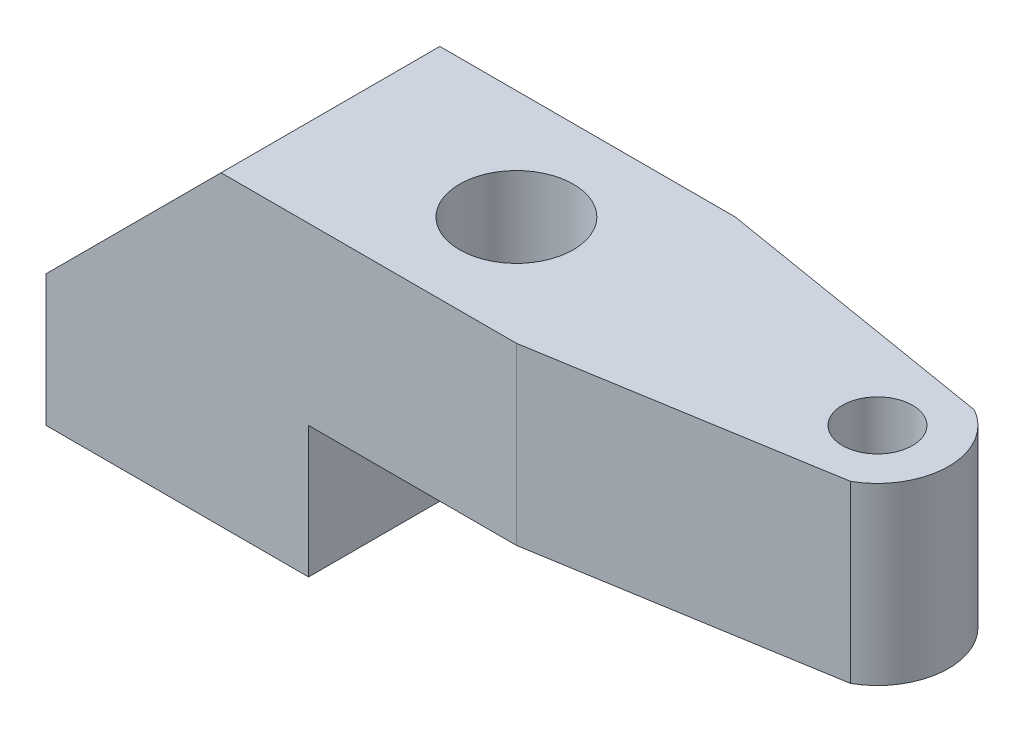
ISO-10303-21;
HEADER;
FILE_DESCRIPTION(('STEP AP214'),'2;1');
FILE_NAME('part.step','',(''),(''),'','','');
FILE_SCHEMA(('AUTOMOTIVE_DESIGN { 1 0 10303 214 1 1 1 1 }'));
ENDSEC;
DATA;
#1=APPLICATION_CONTEXT('core data for automotive mechanical design processes');
#2=APPLICATION_PROTOCOL_DEFINITION('international standard','automotive_design',2000,#1);
#3=PRODUCT_CONTEXT('',#1,'mechanical');
#4=PRODUCT('Part','Part','',(#3));
#5=PRODUCT_RELATED_PRODUCT_CATEGORY('part','',(#4));
#6=PRODUCT_DEFINITION_FORMATION('','',#4);
#7=PRODUCT_DEFINITION_CONTEXT('part definition',#1,'design');
#8=PRODUCT_DEFINITION('design','',#6,#7);
#9=PRODUCT_DEFINITION_SHAPE('','',#8);
#10=(LENGTH_UNIT() NAMED_UNIT(*) SI_UNIT(.MILLI.,.METRE.));
#11=(NAMED_UNIT(*) PLANE_ANGLE_UNIT() SI_UNIT($,.RADIAN.));
#12=(NAMED_UNIT(*) SI_UNIT($,.STERADIAN.) SOLID_ANGLE_UNIT());
#13=UNCERTAINTY_MEASURE_WITH_UNIT(LENGTH_MEASURE(1.E-05),#10,'distance_accuracy_value','');
#14=(GEOMETRIC_REPRESENTATION_CONTEXT(3) GLOBAL_UNCERTAINTY_ASSIGNED_CONTEXT((#13)) GLOBAL_UNIT_ASSIGNED_CONTEXT((#10,
#11,#12)) REPRESENTATION_CONTEXT('',''));
#15=CARTESIAN_POINT('',(0.,0.,0.));
#16=DIRECTION('',(0.,0.,1.));
#17=DIRECTION('',(1.,0.,0.));
#18=AXIS2_PLACEMENT_3D('',#15,#16,#17);
#19=CARTESIAN_POINT('',(231.,14.,-37.25));
#20=DIRECTION('',(0.,-1.,0.));
#21=DIRECTION('',(0.,0.,-1.));
#22=AXIS2_PLACEMENT_3D('',#19,#20,#21);
#23=PLANE('',#22);
#24=DIRECTION('',(-1.,0.,0.));
#25=VECTOR('',#24,1.);
#26=CARTESIAN_POINT('',(219.5,14.,-42.25));
#27=LINE('',#26,#25);
#28=CARTESIAN_POINT('',(219.5,14.,-42.25));
#29=VERTEX_POINT('',#28);
#30=CARTESIAN_POINT('',(206.,14.,-42.25));
#31=VERTEX_POINT('',#30);
#32=EDGE_CURVE('E157',#29,#31,#27,.T.);
#33=ORIENTED_EDGE('',*,*,#32,.T.);
#34=DIRECTION('',(0.,0.,1.));
#35=VECTOR('',#34,1.);
#36=CARTESIAN_POINT('',(206.,14.,-37.25));
#37=LINE('',#36,#35);
#38=CARTESIAN_POINT('',(206.,14.,-32.25));
#39=VERTEX_POINT('',#38);
#40=EDGE_CURVE('E189',#31,#39,#37,.T.);
#41=ORIENTED_EDGE('',*,*,#40,.T.);
#42=DIRECTION('',(1.,0.,0.));
#43=VECTOR('',#42,1.);
#44=CARTESIAN_POINT('',(219.5,14.,-32.25));
#45=LINE('',#44,#43);
#46=CARTESIAN_POINT('',(219.5,14.,-32.25));
#47=VERTEX_POINT('',#46);
#48=EDGE_CURVE('E160',#39,#47,#45,.T.);
#49=ORIENTED_EDGE('',*,*,#48,.T.);
#50=DIRECTION('',(0.986542536377933,0.,-0.163504813130974));
#51=VECTOR('',#50,1.);
#52=CARTESIAN_POINT('',(232.6,14.,-34.4211309680369));
#53=LINE('',#52,#51);
#54=CARTESIAN_POINT('',(232.6,14.,-34.4211309680369));
#55=VERTEX_POINT('',#54);
#56=EDGE_CURVE('E163',#47,#55,#53,.T.);
#57=ORIENTED_EDGE('',*,*,#56,.T.);
#58=CARTESIAN_POINT('',(231.,14.,-37.25));
#59=DIRECTION('',(0.,1.,0.));
#60=DIRECTION('',(0.,0.,-1.));
#61=AXIS2_PLACEMENT_3D('',#58,#59,#60);
#62=CIRCLE('',#61,3.24999999999998);
#63=CARTESIAN_POINT('',(232.6,14.,-40.0788690319631));
#64=VERTEX_POINT('',#63);
#65=EDGE_CURVE('E165',#55,#64,#62,.T.);
#66=ORIENTED_EDGE('',*,*,#65,.T.);
#67=DIRECTION('',(-0.986542536377933,0.,-0.163504813130976));
#68=VECTOR('',#67,1.);
#69=CARTESIAN_POINT('',(232.6,14.,-40.0788690319631));
#70=LINE('',#69,#68);
#71=EDGE_CURVE('E167',#64,#29,#70,.T.);
#72=ORIENTED_EDGE('',*,*,#71,.T.);
#73=EDGE_LOOP('',(#33,#41,#49,#57,#66,#72));
#74=FACE_BOUND('',#73,.T.);
#75=CARTESIAN_POINT('',(231.,14.,-37.25));
#76=DIRECTION('',(0.,1.,0.));
#77=DIRECTION('',(0.,0.,1.));
#78=AXIS2_PLACEMENT_3D('',#75,#76,#77);
#79=CIRCLE('',#78,1.59999999999999);
#80=CARTESIAN_POINT('',(231.,14.,-35.65));
#81=VERTEX_POINT('',#80);
#82=EDGE_CURVE('E152',#81,#81,#79,.T.);
#83=ORIENTED_EDGE('',*,*,#82,.F.);
#84=EDGE_LOOP('',(#83));
#85=FACE_BOUND('',#84,.T.);
#86=CARTESIAN_POINT('',(214.5,14.,-37.25));
#87=DIRECTION('',(0.,1.,0.));
#88=DIRECTION('',(0.,0.,1.));
#89=AXIS2_PLACEMENT_3D('',#86,#87,#88);
#90=CIRCLE('',#89,2.59999999999999);
#91=CARTESIAN_POINT('',(214.5,14.,-34.65));
#92=VERTEX_POINT('',#91);
#93=EDGE_CURVE('E145',#92,#92,#90,.T.);
#94=ORIENTED_EDGE('',*,*,#93,.F.);
#95=EDGE_LOOP('',(#94));
#96=FACE_BOUND('',#95,.T.);
#97=ADVANCED_FACE('F42',(#74,#85,#96),#23,.F.);
#98=CARTESIAN_POINT('',(231.,6.,-37.25));
#99=DIRECTION('',(0.,-1.,0.));
#100=DIRECTION('',(0.,0.,-1.));
#101=AXIS2_PLACEMENT_3D('',#98,#99,#100);
#102=PLANE('',#101);
#103=DIRECTION('',(0.,0.,1.));
#104=VECTOR('',#103,1.);
#105=CARTESIAN_POINT('',(210.,6.,-42.25));
#106=LINE('',#105,#104);
#107=CARTESIAN_POINT('',(210.,6.,-42.25));
#108=VERTEX_POINT('',#107);
#109=CARTESIAN_POINT('',(210.,6.,-32.25));
#110=VERTEX_POINT('',#109);
#111=EDGE_CURVE('E116',#108,#110,#106,.T.);
#112=ORIENTED_EDGE('',*,*,#111,.F.);
#113=DIRECTION('',(-1.,0.,0.));
#114=VECTOR('',#113,1.);
#115=CARTESIAN_POINT('',(219.5,6.,-42.25));
#116=LINE('',#115,#114);
#117=CARTESIAN_POINT('',(219.5,6.,-42.25));
#118=VERTEX_POINT('',#117);
#119=EDGE_CURVE('E122',#118,#108,#116,.T.);
#120=ORIENTED_EDGE('',*,*,#119,.F.);
#121=DIRECTION('',(-0.986542536377933,0.,-0.163504813130976));
#122=VECTOR('',#121,1.);
#123=CARTESIAN_POINT('',(232.6,6.,-40.0788690319631));
#124=LINE('',#123,#122);
#125=CARTESIAN_POINT('',(232.6,6.,-40.0788690319631));
#126=VERTEX_POINT('',#125);
#127=EDGE_CURVE('E161',#126,#118,#124,.T.);
#128=ORIENTED_EDGE('',*,*,#127,.F.);
#129=CARTESIAN_POINT('',(231.,6.,-37.25));
#130=DIRECTION('',(0.,1.,0.));
#131=DIRECTION('',(0.,0.,-1.));
#132=AXIS2_PLACEMENT_3D('',#129,#130,#131);
#133=CIRCLE('',#132,3.24999999999998);
#134=CARTESIAN_POINT('',(232.6,6.,-34.4211309680369));
#135=VERTEX_POINT('',#134);
#136=EDGE_CURVE('E172',#135,#126,#133,.T.);
#137=ORIENTED_EDGE('',*,*,#136,.F.);
#138=DIRECTION('',(0.986542536377933,0.,-0.163504813130974));
#139=VECTOR('',#138,1.);
#140=CARTESIAN_POINT('',(232.6,6.,-34.4211309680369));
#141=LINE('',#140,#139);
#142=CARTESIAN_POINT('',(219.5,6.,-32.25));
#143=VERTEX_POINT('',#142);
#144=EDGE_CURVE('E119',#143,#135,#141,.T.);
#145=ORIENTED_EDGE('',*,*,#144,.F.);
#146=DIRECTION('',(1.,0.,0.));
#147=VECTOR('',#146,1.);
#148=CARTESIAN_POINT('',(219.5,6.,-32.25));
#149=LINE('',#148,#147);
#150=EDGE_CURVE('E110',#110,#143,#149,.T.);
#151=ORIENTED_EDGE('',*,*,#150,.F.);
#152=EDGE_LOOP('',(#112,#120,#128,#137,#145,#151));
#153=FACE_BOUND('',#152,.T.);
#154=CARTESIAN_POINT('',(231.,6.,-37.25));
#155=DIRECTION('',(0.,1.,0.));
#156=DIRECTION('',(0.,0.,1.));
#157=AXIS2_PLACEMENT_3D('',#154,#155,#156);
#158=CIRCLE('',#157,1.59999999999999);
#159=CARTESIAN_POINT('',(231.,6.,-35.65));
#160=VERTEX_POINT('',#159);
#161=EDGE_CURVE('E148',#160,#160,#158,.T.);
#162=ORIENTED_EDGE('',*,*,#161,.T.);
#163=EDGE_LOOP('',(#162));
#164=FACE_BOUND('',#163,.T.);
#165=CARTESIAN_POINT('',(214.5,6.,-37.25));
#166=DIRECTION('',(0.,1.,0.));
#167=DIRECTION('',(0.,0.,1.));
#168=AXIS2_PLACEMENT_3D('',#165,#166,#167);
#169=CIRCLE('',#168,2.59999999999999);
#170=CARTESIAN_POINT('',(214.5,6.,-34.65));
#171=VERTEX_POINT('',#170);
#172=EDGE_CURVE('E149',#171,#171,#169,.T.);
#173=ORIENTED_EDGE('',*,*,#172,.T.);
#174=EDGE_LOOP('',(#173));
#175=FACE_BOUND('',#174,.T.);
#176=ADVANCED_FACE('F112',(#153,#164,#175),#102,.T.);
#177=CARTESIAN_POINT('',(219.5,14.,-42.25));
#178=DIRECTION('',(0.,0.,1.));
#179=DIRECTION('',(1.,0.,0.));
#180=AXIS2_PLACEMENT_3D('',#177,#178,#179);
#181=PLANE('',#180);
#182=DIRECTION('',(0.,-1.,0.));
#183=VECTOR('',#182,1.);
#184=CARTESIAN_POINT('',(198.,14.,-42.25));
#185=LINE('',#184,#183);
#186=CARTESIAN_POINT('',(198.,5.99999999999996,-42.25));
#187=VERTEX_POINT('',#186);
#188=CARTESIAN_POINT('',(198.,0.,-42.25));
#189=VERTEX_POINT('',#188);
#190=EDGE_CURVE('E187',#187,#189,#185,.T.);
#191=ORIENTED_EDGE('',*,*,#190,.F.);
#192=DIRECTION('',(-0.707106781186546,-0.707106781186549,0.));
#193=VECTOR('',#192,1.);
#194=CARTESIAN_POINT('',(206.,14.,-42.25));
#195=LINE('',#194,#193);
#196=EDGE_CURVE('E12',#187,#31,#195,.F.);
#197=ORIENTED_EDGE('',*,*,#196,.T.);
#198=ORIENTED_EDGE('',*,*,#32,.F.);
#199=DIRECTION('',(0.,-1.,0.));
#200=VECTOR('',#199,1.);
#201=CARTESIAN_POINT('',(219.5,14.,-42.25));
#202=LINE('',#201,#200);
#203=EDGE_CURVE('E169',#29,#118,#202,.T.);
#204=ORIENTED_EDGE('',*,*,#203,.T.);
#205=ORIENTED_EDGE('',*,*,#119,.T.);
#206=DIRECTION('',(0.,1.,0.));
#207=VECTOR('',#206,1.);
#208=CARTESIAN_POINT('',(210.,-15.6204993518133,-42.25));
#209=LINE('',#208,#207);
#210=CARTESIAN_POINT('',(210.,0.,-42.25));
#211=VERTEX_POINT('',#210);
#212=EDGE_CURVE('E132',#211,#108,#209,.T.);
#213=ORIENTED_EDGE('',*,*,#212,.F.);
#214=DIRECTION('',(-1.,0.,0.));
#215=VECTOR('',#214,1.);
#216=CARTESIAN_POINT('',(198.,0.,-42.25));
#217=LINE('',#216,#215);
#218=EDGE_CURVE('E342',#211,#189,#217,.T.);
#219=ORIENTED_EDGE('',*,*,#218,.T.);
#220=EDGE_LOOP('',(#191,#197,#198,#204,#205,#213,#219));
#221=FACE_BOUND('',#220,.T.);
#222=ADVANCED_FACE('F212',(#221),#181,.F.);
#223=CARTESIAN_POINT('',(198.,14.,-32.25));
#224=DIRECTION('',(1.,0.,0.));
#225=DIRECTION('',(0.,0.,-1.));
#226=AXIS2_PLACEMENT_3D('',#223,#224,#225);
#227=PLANE('',#226);
#228=DIRECTION('',(0.,-1.,0.));
#229=VECTOR('',#228,1.);
#230=CARTESIAN_POINT('',(198.,14.,-32.25));
#231=LINE('',#230,#229);
#232=CARTESIAN_POINT('',(198.,5.99999999999996,-32.25));
#233=VERTEX_POINT('',#232);
#234=CARTESIAN_POINT('',(198.,0.,-32.25));
#235=VERTEX_POINT('',#234);
#236=EDGE_CURVE('E185',#233,#235,#231,.T.);
#237=ORIENTED_EDGE('',*,*,#236,.F.);
#238=DIRECTION('',(0.,0.,-1.));
#239=VECTOR('',#238,1.);
#240=CARTESIAN_POINT('',(198.,5.99999999999996,-32.25));
#241=LINE('',#240,#239);
#242=EDGE_CURVE('E50',#233,#187,#241,.T.);
#243=ORIENTED_EDGE('',*,*,#242,.T.);
#244=ORIENTED_EDGE('',*,*,#190,.T.);
#245=DIRECTION('',(0.,0.,1.));
#246=VECTOR('',#245,1.);
#247=CARTESIAN_POINT('',(198.,0.,-42.25));
#248=LINE('',#247,#246);
#249=EDGE_CURVE('E139',#189,#235,#248,.T.);
#250=ORIENTED_EDGE('',*,*,#249,.T.);
#251=EDGE_LOOP('',(#237,#243,#244,#250));
#252=FACE_BOUND('',#251,.T.);
#253=ADVANCED_FACE('F239',(#252),#227,.F.);
#254=CARTESIAN_POINT('',(219.5,14.,-32.25));
#255=DIRECTION('',(0.,0.,-1.));
#256=DIRECTION('',(-1.,0.,0.));
#257=AXIS2_PLACEMENT_3D('',#254,#255,#256);
#258=PLANE('',#257);
#259=ORIENTED_EDGE('',*,*,#48,.F.);
#260=DIRECTION('',(0.707106781186546,0.707106781186549,0.));
#261=VECTOR('',#260,1.);
#262=CARTESIAN_POINT('',(206.,14.,-32.25));
#263=LINE('',#262,#261);
#264=EDGE_CURVE('E64',#39,#233,#263,.F.);
#265=ORIENTED_EDGE('',*,*,#264,.T.);
#266=ORIENTED_EDGE('',*,*,#236,.T.);
#267=DIRECTION('',(1.,0.,0.));
#268=VECTOR('',#267,1.);
#269=CARTESIAN_POINT('',(198.,0.,-32.25));
#270=LINE('',#269,#268);
#271=CARTESIAN_POINT('',(210.,0.,-32.25));
#272=VERTEX_POINT('',#271);
#273=EDGE_CURVE('E129',#235,#272,#270,.T.);
#274=ORIENTED_EDGE('',*,*,#273,.T.);
#275=DIRECTION('',(0.,1.,0.));
#276=VECTOR('',#275,1.);
#277=CARTESIAN_POINT('',(210.,-15.6204993518133,-32.25));
#278=LINE('',#277,#276);
#279=EDGE_CURVE('E126',#272,#110,#278,.T.);
#280=ORIENTED_EDGE('',*,*,#279,.T.);
#281=ORIENTED_EDGE('',*,*,#150,.T.);
#282=DIRECTION('',(0.,-1.,0.));
#283=VECTOR('',#282,1.);
#284=CARTESIAN_POINT('',(219.5,14.,-32.25));
#285=LINE('',#284,#283);
#286=EDGE_CURVE('E183',#47,#143,#285,.T.);
#287=ORIENTED_EDGE('',*,*,#286,.F.);
#288=EDGE_LOOP('',(#259,#265,#266,#274,#280,#281,#287));
#289=FACE_BOUND('',#288,.T.);
#290=ADVANCED_FACE('F127',(#289),#258,.F.);
#291=CARTESIAN_POINT('',(232.6,14.,-34.4211309680369));
#292=DIRECTION('',(-0.163504813130974,0.,-0.986542536377933));
#293=DIRECTION('',(-0.986542536377933,0.,0.163504813130974));
#294=AXIS2_PLACEMENT_3D('',#291,#292,#293);
#295=PLANE('',#294);
#296=ORIENTED_EDGE('',*,*,#144,.T.);
#297=DIRECTION('',(0.,-1.,0.));
#298=VECTOR('',#297,1.);
#299=CARTESIAN_POINT('',(232.6,14.,-34.4211309680369));
#300=LINE('',#299,#298);
#301=EDGE_CURVE('E180',#55,#135,#300,.T.);
#302=ORIENTED_EDGE('',*,*,#301,.F.);
#303=ORIENTED_EDGE('',*,*,#56,.F.);
#304=ORIENTED_EDGE('',*,*,#286,.T.);
#305=EDGE_LOOP('',(#296,#302,#303,#304));
#306=FACE_BOUND('',#305,.T.);
#307=ADVANCED_FACE('F201',(#306),#295,.F.);
#308=CARTESIAN_POINT('',(231.,14.,-37.25));
#309=DIRECTION('',(0.,-1.,0.));
#310=DIRECTION('',(0.,0.,-1.));
#311=AXIS2_PLACEMENT_3D('',#308,#309,#310);
#312=CYLINDRICAL_SURFACE('',#311,3.24999999999998);
#313=ORIENTED_EDGE('',*,*,#136,.T.);
#314=DIRECTION('',(0.,-1.,0.));
#315=VECTOR('',#314,1.);
#316=CARTESIAN_POINT('',(232.6,14.,-40.0788690319631));
#317=LINE('',#316,#315);
#318=EDGE_CURVE('E177',#64,#126,#317,.T.);
#319=ORIENTED_EDGE('',*,*,#318,.F.);
#320=ORIENTED_EDGE('',*,*,#65,.F.);
#321=ORIENTED_EDGE('',*,*,#301,.T.);
#322=EDGE_LOOP('',(#313,#319,#320,#321));
#323=FACE_BOUND('',#322,.T.);
#324=ADVANCED_FACE('F207',(#323),#312,.T.);
#325=CARTESIAN_POINT('',(232.6,14.,-40.0788690319631));
#326=DIRECTION('',(-0.163504813130976,0.,0.986542536377933));
#327=DIRECTION('',(0.986542536377933,0.,0.163504813130976));
#328=AXIS2_PLACEMENT_3D('',#325,#326,#327);
#329=PLANE('',#328);
#330=ORIENTED_EDGE('',*,*,#127,.T.);
#331=ORIENTED_EDGE('',*,*,#203,.F.);
#332=ORIENTED_EDGE('',*,*,#71,.F.);
#333=ORIENTED_EDGE('',*,*,#318,.T.);
#334=EDGE_LOOP('',(#330,#331,#332,#333));
#335=FACE_BOUND('',#334,.T.);
#336=ADVANCED_FACE('F210',(#335),#329,.F.);
#337=CARTESIAN_POINT('',(231.,14.,-37.25));
#338=DIRECTION('',(0.,-1.,0.));
#339=DIRECTION('',(0.,0.,-1.));
#340=AXIS2_PLACEMENT_3D('',#337,#338,#339);
#341=CYLINDRICAL_SURFACE('',#340,1.59999999999999);
#342=ORIENTED_EDGE('',*,*,#82,.T.);
#343=EDGE_LOOP('',(#342));
#344=FACE_BOUND('',#343,.T.);
#345=ORIENTED_EDGE('',*,*,#161,.F.);
#346=EDGE_LOOP('',(#345));
#347=FACE_BOUND('',#346,.T.);
#348=ADVANCED_FACE('F228',(#344,#347),#341,.F.);
#349=CARTESIAN_POINT('',(214.5,14.,-37.25));
#350=DIRECTION('',(0.,-1.,0.));
#351=DIRECTION('',(0.,0.,-1.));
#352=AXIS2_PLACEMENT_3D('',#349,#350,#351);
#353=CYLINDRICAL_SURFACE('',#352,2.59999999999999);
#354=ORIENTED_EDGE('',*,*,#93,.T.);
#355=EDGE_LOOP('',(#354));
#356=FACE_BOUND('',#355,.T.);
#357=ORIENTED_EDGE('',*,*,#172,.F.);
#358=EDGE_LOOP('',(#357));
#359=FACE_BOUND('',#358,.T.);
#360=ADVANCED_FACE('F272',(#356,#359),#353,.F.);
#361=CARTESIAN_POINT('',(210.,-15.6204993518133,-42.25));
#362=DIRECTION('',(-1.,0.,0.));
#363=DIRECTION('',(0.,0.,1.));
#364=AXIS2_PLACEMENT_3D('',#361,#362,#363);
#365=PLANE('',#364);
#366=ORIENTED_EDGE('',*,*,#279,.F.);
#367=DIRECTION('',(0.,0.,-1.));
#368=VECTOR('',#367,1.);
#369=CARTESIAN_POINT('',(210.,0.,-42.25));
#370=LINE('',#369,#368);
#371=EDGE_CURVE('E144',#272,#211,#370,.T.);
#372=ORIENTED_EDGE('',*,*,#371,.T.);
#373=ORIENTED_EDGE('',*,*,#212,.T.);
#374=ORIENTED_EDGE('',*,*,#111,.T.);
#375=EDGE_LOOP('',(#366,#372,#373,#374));
#376=FACE_BOUND('',#375,.T.);
#377=ADVANCED_FACE('F135',(#376),#365,.F.);
#378=CARTESIAN_POINT('',(0.,0.,0.));
#379=DIRECTION('',(0.,1.,0.));
#380=DIRECTION('',(0.,0.,1.));
#381=AXIS2_PLACEMENT_3D('',#378,#379,#380);
#382=PLANE('',#381);
#383=ORIENTED_EDGE('',*,*,#218,.F.);
#384=ORIENTED_EDGE('',*,*,#371,.F.);
#385=ORIENTED_EDGE('',*,*,#273,.F.);
#386=ORIENTED_EDGE('',*,*,#249,.F.);
#387=EDGE_LOOP('',(#383,#384,#385,#386));
#388=FACE_BOUND('',#387,.T.);
#389=ADVANCED_FACE('F215',(#388),#382,.F.);
#390=CARTESIAN_POINT('',(206.,14.,-37.25));
#391=DIRECTION('',(0.707106781186549,-0.707106781186546,0.));
#392=DIRECTION('',(0.,0.,1.));
#393=AXIS2_PLACEMENT_3D('',#390,#391,#392);
#394=PLANE('',#393);
#395=ORIENTED_EDGE('',*,*,#196,.F.);
#396=ORIENTED_EDGE('',*,*,#242,.F.);
#397=ORIENTED_EDGE('',*,*,#264,.F.);
#398=ORIENTED_EDGE('',*,*,#40,.F.);
#399=EDGE_LOOP('',(#395,#396,#397,#398));
#400=FACE_BOUND('',#399,.T.);
#401=ADVANCED_FACE('F44',(#400),#394,.F.);
#402=CLOSED_SHELL('',(#97,#176,#222,#253,#290,#307,#324,#336,#348,#360,#377,#389,#401));
#403=MANIFOLD_SOLID_BREP('B2',#402);
#404=ADVANCED_BREP_SHAPE_REPRESENTATION('',(#18,#403),#14);
#405=SHAPE_DEFINITION_REPRESENTATION(#9,#404);
ENDSEC;
END-ISO-10303-21;
